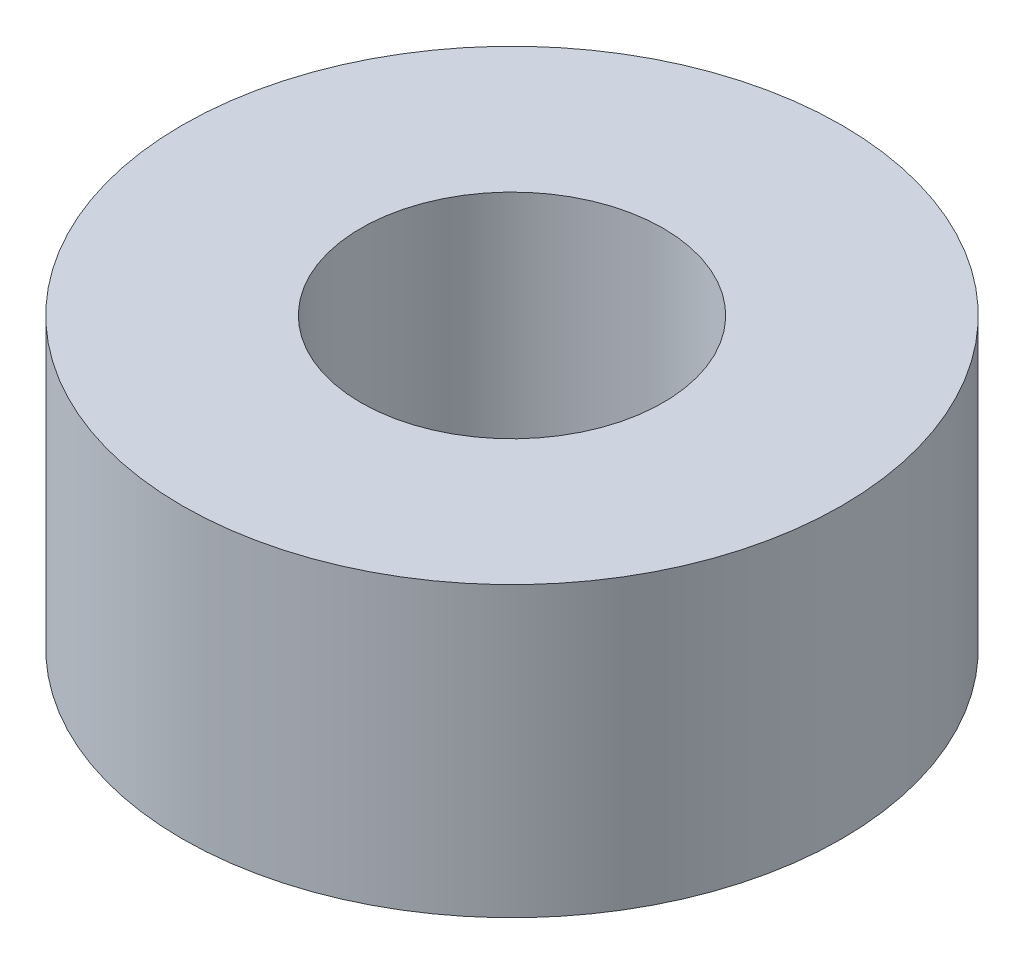
ISO-10303-21;
HEADER;
FILE_DESCRIPTION(('STEP AP214'),'2;1');
FILE_NAME('part.step','',(''),(''),'','','');
FILE_SCHEMA(('AUTOMOTIVE_DESIGN { 1 0 10303 214 1 1 1 1 }'));
ENDSEC;
DATA;
#1=APPLICATION_CONTEXT('core data for automotive mechanical design processes');
#2=APPLICATION_PROTOCOL_DEFINITION('international standard','automotive_design',2000,#1);
#3=PRODUCT_CONTEXT('',#1,'mechanical');
#4=PRODUCT('Part','Part','',(#3));
#5=PRODUCT_RELATED_PRODUCT_CATEGORY('part','',(#4));
#6=PRODUCT_DEFINITION_FORMATION('','',#4);
#7=PRODUCT_DEFINITION_CONTEXT('part definition',#1,'design');
#8=PRODUCT_DEFINITION('design','',#6,#7);
#9=PRODUCT_DEFINITION_SHAPE('','',#8);
#10=(LENGTH_UNIT() NAMED_UNIT(*) SI_UNIT(.MILLI.,.METRE.));
#11=(NAMED_UNIT(*) PLANE_ANGLE_UNIT() SI_UNIT($,.RADIAN.));
#12=(NAMED_UNIT(*) SI_UNIT($,.STERADIAN.) SOLID_ANGLE_UNIT());
#13=UNCERTAINTY_MEASURE_WITH_UNIT(LENGTH_MEASURE(1.E-05),#10,'distance_accuracy_value','');
#14=(GEOMETRIC_REPRESENTATION_CONTEXT(3) GLOBAL_UNCERTAINTY_ASSIGNED_CONTEXT((#13)) GLOBAL_UNIT_ASSIGNED_CONTEXT((#10,
#11,#12)) REPRESENTATION_CONTEXT('',''));
#15=CARTESIAN_POINT('',(0.,0.,0.));
#16=DIRECTION('',(0.,0.,1.));
#17=DIRECTION('',(1.,0.,0.));
#18=AXIS2_PLACEMENT_3D('',#15,#16,#17);
#19=CARTESIAN_POINT('',(0.,10.5,0.));
#20=DIRECTION('',(0.,1.,0.));
#21=DIRECTION('',(0.,0.,1.));
#22=AXIS2_PLACEMENT_3D('',#19,#20,#21);
#23=PLANE('',#22);
#24=CARTESIAN_POINT('',(0.,10.5,0.));
#25=DIRECTION('',(0.,1.,0.));
#26=DIRECTION('',(0.,0.,1.));
#27=AXIS2_PLACEMENT_3D('',#24,#25,#26);
#28=CIRCLE('',#27,12.);
#29=CARTESIAN_POINT('',(0.,10.5,-12.));
#30=VERTEX_POINT('',#29);
#31=EDGE_CURVE('E10',#30,#30,#28,.T.);
#32=ORIENTED_EDGE('',*,*,#31,.T.);
#33=EDGE_LOOP('',(#32));
#34=FACE_BOUND('',#33,.T.);
#35=CARTESIAN_POINT('',(0.,10.5,0.));
#36=DIRECTION('',(0.,1.,0.));
#37=DIRECTION('',(0.,0.,1.));
#38=AXIS2_PLACEMENT_3D('',#35,#36,#37);
#39=CIRCLE('',#38,5.5);
#40=CARTESIAN_POINT('',(0.,10.5,-5.5));
#41=VERTEX_POINT('',#40);
#42=EDGE_CURVE('E46',#41,#41,#39,.T.);
#43=ORIENTED_EDGE('',*,*,#42,.F.);
#44=EDGE_LOOP('',(#43));
#45=FACE_BOUND('',#44,.T.);
#46=ADVANCED_FACE('F35',(#34,#45),#23,.T.);
#47=CARTESIAN_POINT('',(0.,0.,0.));
#48=DIRECTION('',(0.,1.,0.));
#49=DIRECTION('',(0.,0.,1.));
#50=AXIS2_PLACEMENT_3D('',#47,#48,#49);
#51=PLANE('',#50);
#52=CARTESIAN_POINT('',(0.,0.,0.));
#53=DIRECTION('',(0.,1.,0.));
#54=DIRECTION('',(0.,0.,1.));
#55=AXIS2_PLACEMENT_3D('',#52,#53,#54);
#56=CIRCLE('',#55,12.);
#57=CARTESIAN_POINT('',(0.,0.,-12.));
#58=VERTEX_POINT('',#57);
#59=EDGE_CURVE('E39',#58,#58,#56,.T.);
#60=ORIENTED_EDGE('',*,*,#59,.F.);
#61=EDGE_LOOP('',(#60));
#62=FACE_BOUND('',#61,.T.);
#63=CARTESIAN_POINT('',(0.,0.,0.));
#64=DIRECTION('',(0.,1.,0.));
#65=DIRECTION('',(0.,0.,1.));
#66=AXIS2_PLACEMENT_3D('',#63,#64,#65);
#67=CIRCLE('',#66,5.5);
#68=CARTESIAN_POINT('',(0.,0.,-5.5));
#69=VERTEX_POINT('',#68);
#70=EDGE_CURVE('E48',#69,#69,#67,.T.);
#71=ORIENTED_EDGE('',*,*,#70,.T.);
#72=EDGE_LOOP('',(#71));
#73=FACE_BOUND('',#72,.T.);
#74=ADVANCED_FACE('F58',(#62,#73),#51,.F.);
#75=CARTESIAN_POINT('',(0.,10.5,0.));
#76=DIRECTION('',(0.,-1.,0.));
#77=DIRECTION('',(0.,0.,-1.));
#78=AXIS2_PLACEMENT_3D('',#75,#76,#77);
#79=CYLINDRICAL_SURFACE('',#78,12.);
#80=CARTESIAN_POINT('',(0.,10.5,-12.));
#81=CARTESIAN_POINT('',(0.,10.390625,-12.));
#82=CARTESIAN_POINT('',(0.,10.28125,-12.));
#83=CARTESIAN_POINT('',(0.,10.0625,-12.));
#84=CARTESIAN_POINT('',(0.,9.953125,-12.));
#85=CARTESIAN_POINT('',(0.,9.734375,-12.));
#86=CARTESIAN_POINT('',(0.,9.625,-12.));
#87=CARTESIAN_POINT('',(0.,9.40625,-12.));
#88=CARTESIAN_POINT('',(0.,9.296875,-12.));
#89=CARTESIAN_POINT('',(0.,9.078125,-12.));
#90=CARTESIAN_POINT('',(0.,8.96875,-12.));
#91=CARTESIAN_POINT('',(0.,8.75,-12.));
#92=CARTESIAN_POINT('',(0.,8.640625,-12.));
#93=CARTESIAN_POINT('',(0.,8.421875,-12.));
#94=CARTESIAN_POINT('',(0.,8.3125,-12.));
#95=CARTESIAN_POINT('',(0.,8.09375,-12.));
#96=CARTESIAN_POINT('',(0.,7.984375,-12.));
#97=CARTESIAN_POINT('',(0.,7.765625,-12.));
#98=CARTESIAN_POINT('',(0.,7.65625,-12.));
#99=CARTESIAN_POINT('',(0.,7.4375,-12.));
#100=CARTESIAN_POINT('',(0.,7.328125,-12.));
#101=CARTESIAN_POINT('',(0.,7.109375,-12.));
#102=CARTESIAN_POINT('',(0.,7.,-12.));
#103=CARTESIAN_POINT('',(0.,6.78125,-12.));
#104=CARTESIAN_POINT('',(0.,6.671875,-12.));
#105=CARTESIAN_POINT('',(0.,6.453125,-12.));
#106=CARTESIAN_POINT('',(0.,6.34375,-12.));
#107=CARTESIAN_POINT('',(0.,6.125,-12.));
#108=CARTESIAN_POINT('',(0.,6.015625,-12.));
#109=CARTESIAN_POINT('',(0.,5.796875,-12.));
#110=CARTESIAN_POINT('',(0.,5.6875,-12.));
#111=CARTESIAN_POINT('',(0.,5.46875,-12.));
#112=CARTESIAN_POINT('',(0.,5.359375,-12.));
#113=CARTESIAN_POINT('',(0.,5.140625,-12.));
#114=CARTESIAN_POINT('',(0.,5.03125,-12.));
#115=CARTESIAN_POINT('',(0.,4.8125,-12.));
#116=CARTESIAN_POINT('',(0.,4.703125,-12.));
#117=CARTESIAN_POINT('',(0.,4.484375,-12.));
#118=CARTESIAN_POINT('',(0.,4.375,-12.));
#119=CARTESIAN_POINT('',(0.,4.15625,-12.));
#120=CARTESIAN_POINT('',(0.,4.046875,-12.));
#121=CARTESIAN_POINT('',(0.,3.828125,-12.));
#122=CARTESIAN_POINT('',(0.,3.71875,-12.));
#123=CARTESIAN_POINT('',(0.,3.5,-12.));
#124=CARTESIAN_POINT('',(0.,3.390625,-12.));
#125=CARTESIAN_POINT('',(0.,3.171875,-12.));
#126=CARTESIAN_POINT('',(0.,3.0625,-12.));
#127=CARTESIAN_POINT('',(0.,2.84375,-12.));
#128=CARTESIAN_POINT('',(0.,2.734375,-12.));
#129=CARTESIAN_POINT('',(0.,2.515625,-12.));
#130=CARTESIAN_POINT('',(0.,2.40625,-12.));
#131=CARTESIAN_POINT('',(0.,2.1875,-12.));
#132=CARTESIAN_POINT('',(0.,2.078125,-12.));
#133=CARTESIAN_POINT('',(0.,1.859375,-12.));
#134=CARTESIAN_POINT('',(0.,1.75,-12.));
#135=CARTESIAN_POINT('',(0.,1.53125,-12.));
#136=CARTESIAN_POINT('',(0.,1.421875,-12.));
#137=CARTESIAN_POINT('',(0.,1.203125,-12.));
#138=CARTESIAN_POINT('',(0.,1.09375,-12.));
#139=CARTESIAN_POINT('',(0.,0.875000000000001,-12.));
#140=CARTESIAN_POINT('',(0.,0.765625000000001,-12.));
#141=CARTESIAN_POINT('',(0.,0.546875,-12.));
#142=CARTESIAN_POINT('',(0.,0.4375,-12.));
#143=CARTESIAN_POINT('',(0.,0.21875,-12.));
#144=CARTESIAN_POINT('',(0.,0.109375,-12.));
#145=CARTESIAN_POINT('',(0.,0.,-12.));
#146=B_SPLINE_CURVE_WITH_KNOTS('',3,(#80,#81,#82,#83,#84,#85,#86,#87,#88,#89,#90,#91,#92,#93,
#94,#95,#96,#97,#98,#99,#100,#101,#102,#103,#104,#105,#106,#107,#108,#109,#110,#111,#112,#113,
#114,#115,#116,#117,#118,#119,#120,#121,#122,#123,#124,#125,#126,#127,#128,#129,#130,#131,#132,
#133,#134,#135,#136,#137,#138,#139,#140,#141,#142,#143,#144,#145),.UNSPECIFIED.,.F.,.F.,(4,2,2,
2,2,2,2,2,2,2,2,2,2,2,2,2,2,2,2,2,2,2,2,2,2,2,2,2,2,2,2,2,4),(0.,0.328125,0.656250000000001,
0.984375000000001,1.3125,1.640625,1.96875,2.296875,2.625,2.953125,3.28125,3.609375,3.9375,
4.265625,4.59375,4.921875,5.25,5.578125,5.90625,6.234375,6.5625,6.890625,7.21875,7.546875,7.875,
8.203125,8.53125,8.859375,9.1875,9.515625,9.84375,10.171875,10.5),.UNSPECIFIED.);
#147=EDGE_CURVE('BSEAM37',#30,#58,#146,.T.);
#148=ORIENTED_EDGE('',*,*,#31,.F.);
#149=ORIENTED_EDGE('',*,*,#59,.T.);
#150=ORIENTED_EDGE('',*,*,#147,.T.);
#151=ORIENTED_EDGE('',*,*,#147,.F.);
#152=EDGE_LOOP('',(#148,#150,#149,#151));
#153=FACE_BOUND('',#152,.T.);
#154=ADVANCED_FACE('F37',(#153),#79,.T.);
#155=CARTESIAN_POINT('',(0.,10.5,0.));
#156=DIRECTION('',(0.,-1.,0.));
#157=DIRECTION('',(0.,0.,-1.));
#158=AXIS2_PLACEMENT_3D('',#155,#156,#157);
#159=CYLINDRICAL_SURFACE('',#158,5.5);
#160=CARTESIAN_POINT('',(0.,10.5,-5.5));
#161=CARTESIAN_POINT('',(0.,10.390625,-5.5));
#162=CARTESIAN_POINT('',(0.,10.28125,-5.5));
#163=CARTESIAN_POINT('',(0.,10.0625,-5.5));
#164=CARTESIAN_POINT('',(0.,9.953125,-5.5));
#165=CARTESIAN_POINT('',(0.,9.734375,-5.5));
#166=CARTESIAN_POINT('',(0.,9.625,-5.5));
#167=CARTESIAN_POINT('',(0.,9.40625,-5.5));
#168=CARTESIAN_POINT('',(0.,9.296875,-5.5));
#169=CARTESIAN_POINT('',(0.,9.078125,-5.5));
#170=CARTESIAN_POINT('',(0.,8.96875,-5.5));
#171=CARTESIAN_POINT('',(0.,8.75,-5.5));
#172=CARTESIAN_POINT('',(0.,8.640625,-5.5));
#173=CARTESIAN_POINT('',(0.,8.421875,-5.5));
#174=CARTESIAN_POINT('',(0.,8.3125,-5.5));
#175=CARTESIAN_POINT('',(0.,8.09375,-5.5));
#176=CARTESIAN_POINT('',(0.,7.984375,-5.5));
#177=CARTESIAN_POINT('',(0.,7.765625,-5.5));
#178=CARTESIAN_POINT('',(0.,7.65625,-5.5));
#179=CARTESIAN_POINT('',(0.,7.4375,-5.5));
#180=CARTESIAN_POINT('',(0.,7.328125,-5.5));
#181=CARTESIAN_POINT('',(0.,7.109375,-5.5));
#182=CARTESIAN_POINT('',(0.,7.,-5.5));
#183=CARTESIAN_POINT('',(0.,6.78125,-5.5));
#184=CARTESIAN_POINT('',(0.,6.671875,-5.5));
#185=CARTESIAN_POINT('',(0.,6.453125,-5.5));
#186=CARTESIAN_POINT('',(0.,6.34375,-5.5));
#187=CARTESIAN_POINT('',(0.,6.125,-5.5));
#188=CARTESIAN_POINT('',(0.,6.015625,-5.5));
#189=CARTESIAN_POINT('',(0.,5.796875,-5.5));
#190=CARTESIAN_POINT('',(0.,5.6875,-5.5));
#191=CARTESIAN_POINT('',(0.,5.46875,-5.5));
#192=CARTESIAN_POINT('',(0.,5.359375,-5.5));
#193=CARTESIAN_POINT('',(0.,5.140625,-5.5));
#194=CARTESIAN_POINT('',(0.,5.03125,-5.5));
#195=CARTESIAN_POINT('',(0.,4.8125,-5.5));
#196=CARTESIAN_POINT('',(0.,4.703125,-5.5));
#197=CARTESIAN_POINT('',(0.,4.484375,-5.5));
#198=CARTESIAN_POINT('',(0.,4.375,-5.5));
#199=CARTESIAN_POINT('',(0.,4.15625,-5.5));
#200=CARTESIAN_POINT('',(0.,4.046875,-5.5));
#201=CARTESIAN_POINT('',(0.,3.828125,-5.5));
#202=CARTESIAN_POINT('',(0.,3.71875,-5.5));
#203=CARTESIAN_POINT('',(0.,3.5,-5.5));
#204=CARTESIAN_POINT('',(0.,3.390625,-5.5));
#205=CARTESIAN_POINT('',(0.,3.171875,-5.5));
#206=CARTESIAN_POINT('',(0.,3.0625,-5.5));
#207=CARTESIAN_POINT('',(0.,2.84375,-5.5));
#208=CARTESIAN_POINT('',(0.,2.734375,-5.5));
#209=CARTESIAN_POINT('',(0.,2.515625,-5.5));
#210=CARTESIAN_POINT('',(0.,2.40625,-5.5));
#211=CARTESIAN_POINT('',(0.,2.1875,-5.5));
#212=CARTESIAN_POINT('',(0.,2.078125,-5.5));
#213=CARTESIAN_POINT('',(0.,1.859375,-5.5));
#214=CARTESIAN_POINT('',(0.,1.75,-5.5));
#215=CARTESIAN_POINT('',(0.,1.53125,-5.5));
#216=CARTESIAN_POINT('',(0.,1.421875,-5.5));
#217=CARTESIAN_POINT('',(0.,1.203125,-5.5));
#218=CARTESIAN_POINT('',(0.,1.09375,-5.5));
#219=CARTESIAN_POINT('',(0.,0.875000000000001,-5.5));
#220=CARTESIAN_POINT('',(0.,0.765625000000001,-5.5));
#221=CARTESIAN_POINT('',(0.,0.546875,-5.5));
#222=CARTESIAN_POINT('',(0.,0.4375,-5.5));
#223=CARTESIAN_POINT('',(0.,0.21875,-5.5));
#224=CARTESIAN_POINT('',(0.,0.109375,-5.5));
#225=CARTESIAN_POINT('',(0.,0.,-5.5));
#226=B_SPLINE_CURVE_WITH_KNOTS('',3,(#160,#161,#162,#163,#164,#165,#166,#167,#168,#169,#170,
#171,#172,#173,#174,#175,#176,#177,#178,#179,#180,#181,#182,#183,#184,#185,#186,#187,#188,#189,
#190,#191,#192,#193,#194,#195,#196,#197,#198,#199,#200,#201,#202,#203,#204,#205,#206,#207,#208,
#209,#210,#211,#212,#213,#214,#215,#216,#217,#218,#219,#220,#221,#222,#223,#224,#225),
.UNSPECIFIED.,.F.,.F.,(4,2,2,2,2,2,2,2,2,2,2,2,2,2,2,2,2,2,2,2,2,2,2,2,2,2,2,2,2,2,2,2,4),(0.,
0.328124999999999,0.656249999999999,0.984374999999999,1.3125,1.640625,1.96875,2.296875,2.625,
2.953125,3.28125,3.609375,3.9375,4.265625,4.59375,4.921875,5.25,5.578125,5.90625,6.234375,
6.5625,6.890625,7.21875,7.546875,7.875,8.203125,8.53125,8.859375,9.1875,9.515625,9.84375,
10.171875,10.5),.UNSPECIFIED.);
#227=EDGE_CURVE('BSEAM54',#41,#69,#226,.T.);
#228=ORIENTED_EDGE('',*,*,#42,.T.);
#229=ORIENTED_EDGE('',*,*,#70,.F.);
#230=ORIENTED_EDGE('',*,*,#227,.T.);
#231=ORIENTED_EDGE('',*,*,#227,.F.);
#232=EDGE_LOOP('',(#228,#230,#229,#231));
#233=FACE_BOUND('',#232,.T.);
#234=ADVANCED_FACE('F54',(#233),#159,.F.);
#235=CLOSED_SHELL('',(#46,#74,#154,#234));
#236=MANIFOLD_SOLID_BREP('B2',#235);
#237=ADVANCED_BREP_SHAPE_REPRESENTATION('',(#18,#236),#14);
#238=SHAPE_DEFINITION_REPRESENTATION(#9,#237);
ENDSEC;
END-ISO-10303-21;
